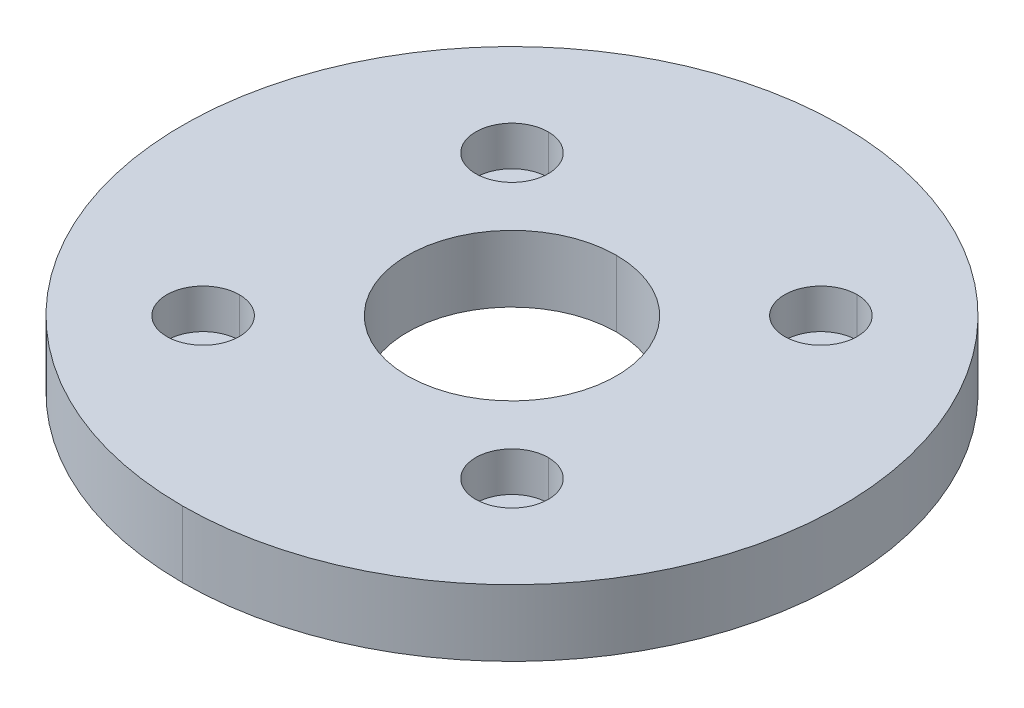
ISO-10303-21;
HEADER;
FILE_DESCRIPTION(('STEP AP214'),'2;1');
FILE_NAME('part.step','',(''),(''),'','','');
FILE_SCHEMA(('AUTOMOTIVE_DESIGN { 1 0 10303 214 1 1 1 1 }'));
ENDSEC;
DATA;
#1=APPLICATION_CONTEXT('core data for automotive mechanical design processes');
#2=APPLICATION_PROTOCOL_DEFINITION('international standard','automotive_design',2000,#1);
#3=PRODUCT_CONTEXT('',#1,'mechanical');
#4=PRODUCT('Part','Part','',(#3));
#5=PRODUCT_RELATED_PRODUCT_CATEGORY('part','',(#4));
#6=PRODUCT_DEFINITION_FORMATION('','',#4);
#7=PRODUCT_DEFINITION_CONTEXT('part definition',#1,'design');
#8=PRODUCT_DEFINITION('design','',#6,#7);
#9=PRODUCT_DEFINITION_SHAPE('','',#8);
#10=(LENGTH_UNIT() NAMED_UNIT(*) SI_UNIT(.MILLI.,.METRE.));
#11=(NAMED_UNIT(*) PLANE_ANGLE_UNIT() SI_UNIT($,.RADIAN.));
#12=(NAMED_UNIT(*) SI_UNIT($,.STERADIAN.) SOLID_ANGLE_UNIT());
#13=UNCERTAINTY_MEASURE_WITH_UNIT(LENGTH_MEASURE(1.E-05),#10,'distance_accuracy_value','');
#14=(GEOMETRIC_REPRESENTATION_CONTEXT(3) GLOBAL_UNCERTAINTY_ASSIGNED_CONTEXT((#13)) GLOBAL_UNIT_ASSIGNED_CONTEXT((#10,
#11,#12)) REPRESENTATION_CONTEXT('',''));
#15=CARTESIAN_POINT('',(0.,0.,0.));
#16=DIRECTION('',(0.,0.,1.));
#17=DIRECTION('',(1.,0.,0.));
#18=AXIS2_PLACEMENT_3D('',#15,#16,#17);
#19=CARTESIAN_POINT('',(8.1317279836453,1.42,-8.1317279836453));
#20=DIRECTION('',(0.,1.,0.));
#21=DIRECTION('',(0.,0.,1.));
#22=AXIS2_PLACEMENT_3D('',#19,#20,#21);
#23=CYLINDRICAL_SURFACE('',#22,1.91);
#24=DIRECTION('',(0.,1.,0.));
#25=VECTOR('',#24,1.);
#26=CARTESIAN_POINT('',(8.1317279836453,1.42,-10.0417279836453));
#27=LINE('',#26,#25);
#28=CARTESIAN_POINT('',(8.1317279836453,1.42,-10.0417279836453));
#29=VERTEX_POINT('',#28);
#30=CARTESIAN_POINT('',(8.1317279836453,3.5,-10.0417279836453));
#31=VERTEX_POINT('',#30);
#32=EDGE_CURVE('E332',#29,#31,#27,.T.);
#33=ORIENTED_EDGE('',*,*,#32,.F.);
#34=CARTESIAN_POINT('',(8.1317279836453,1.42,-8.1317279836453));
#35=DIRECTION('',(0.,1.,0.));
#36=DIRECTION('',(0.,0.,1.));
#37=AXIS2_PLACEMENT_3D('',#34,#35,#36);
#38=CIRCLE('',#37,1.91);
#39=CARTESIAN_POINT('',(8.1317279836453,1.42,-6.2217279836453));
#40=VERTEX_POINT('',#39);
#41=EDGE_CURVE('E10',#40,#29,#38,.T.);
#42=ORIENTED_EDGE('',*,*,#41,.F.);
#43=DIRECTION('',(0.,1.,0.));
#44=VECTOR('',#43,1.);
#45=CARTESIAN_POINT('',(8.1317279836453,1.42,-6.2217279836453));
#46=LINE('',#45,#44);
#47=CARTESIAN_POINT('',(8.1317279836453,3.5,-6.2217279836453));
#48=VERTEX_POINT('',#47);
#49=EDGE_CURVE('E312',#40,#48,#46,.T.);
#50=ORIENTED_EDGE('',*,*,#49,.T.);
#51=CARTESIAN_POINT('',(8.1317279836453,3.5,-8.1317279836453));
#52=DIRECTION('',(0.,1.,0.));
#53=DIRECTION('',(0.,0.,1.));
#54=AXIS2_PLACEMENT_3D('',#51,#52,#53);
#55=CIRCLE('',#54,1.91);
#56=EDGE_CURVE('E356',#48,#31,#55,.T.);
#57=ORIENTED_EDGE('',*,*,#56,.T.);
#58=EDGE_LOOP('',(#33,#42,#50,#57));
#59=FACE_BOUND('',#58,.T.);
#60=ADVANCED_FACE('F16',(#59),#23,.F.);
#61=CARTESIAN_POINT('',(8.1317279836453,1.42,-8.1317279836453));
#62=DIRECTION('',(0.,1.,0.));
#63=DIRECTION('',(1.,0.,0.));
#64=AXIS2_PLACEMENT_3D('',#61,#62,#63);
#65=PLANE('',#64);
#66=CARTESIAN_POINT('',(8.1317279836453,1.42,-8.1317279836453));
#67=DIRECTION('',(0.,-1.,0.));
#68=DIRECTION('',(0.,0.,1.));
#69=AXIS2_PLACEMENT_3D('',#66,#67,#68);
#70=CIRCLE('',#69,1.);
#71=CARTESIAN_POINT('',(8.1317279836453,1.42,-7.13172798364529));
#72=VERTEX_POINT('',#71);
#73=CARTESIAN_POINT('',(8.1317279836453,1.42,-9.1317279836453));
#74=VERTEX_POINT('',#73);
#75=EDGE_CURVE('E249',#72,#74,#70,.T.);
#76=ORIENTED_EDGE('',*,*,#75,.T.);
#77=CARTESIAN_POINT('',(8.1317279836453,1.42,-8.1317279836453));
#78=DIRECTION('',(0.,-1.,0.));
#79=DIRECTION('',(0.,0.,1.));
#80=AXIS2_PLACEMENT_3D('',#77,#78,#79);
#81=CIRCLE('',#80,1.);
#82=EDGE_CURVE('E41',#74,#72,#81,.T.);
#83=ORIENTED_EDGE('',*,*,#82,.T.);
#84=EDGE_LOOP('',(#76,#83));
#85=FACE_BOUND('',#84,.T.);
#86=ORIENTED_EDGE('',*,*,#41,.T.);
#87=CARTESIAN_POINT('',(8.1317279836453,1.42,-8.1317279836453));
#88=DIRECTION('',(0.,1.,0.));
#89=DIRECTION('',(0.,0.,1.));
#90=AXIS2_PLACEMENT_3D('',#87,#88,#89);
#91=CIRCLE('',#90,1.91);
#92=EDGE_CURVE('E328',#29,#40,#91,.T.);
#93=ORIENTED_EDGE('',*,*,#92,.T.);
#94=EDGE_LOOP('',(#86,#93));
#95=FACE_BOUND('',#94,.T.);
#96=ADVANCED_FACE('F817',(#85,#95),#65,.T.);
#97=CARTESIAN_POINT('',(7.42462120245875,1.42,7.42462120245875));
#98=DIRECTION('',(0.,1.,0.));
#99=DIRECTION('',(0.,0.,1.));
#100=AXIS2_PLACEMENT_3D('',#97,#98,#99);
#101=CYLINDRICAL_SURFACE('',#100,1.91);
#102=DIRECTION('',(0.,1.,0.));
#103=VECTOR('',#102,1.);
#104=CARTESIAN_POINT('',(7.42462120245875,1.42,5.51462120245875));
#105=LINE('',#104,#103);
#106=CARTESIAN_POINT('',(7.42462120245875,1.42,5.51462120245875));
#107=VERTEX_POINT('',#106);
#108=CARTESIAN_POINT('',(7.42462120245875,3.5,5.51462120245875));
#109=VERTEX_POINT('',#108);
#110=EDGE_CURVE('E311',#107,#109,#105,.T.);
#111=ORIENTED_EDGE('',*,*,#110,.F.);
#112=CARTESIAN_POINT('',(7.42462120245875,1.42,7.42462120245875));
#113=DIRECTION('',(0.,1.,0.));
#114=DIRECTION('',(0.,0.,1.));
#115=AXIS2_PLACEMENT_3D('',#112,#113,#114);
#116=CIRCLE('',#115,1.91);
#117=CARTESIAN_POINT('',(7.42462120245875,1.42,9.33462120245875));
#118=VERTEX_POINT('',#117);
#119=EDGE_CURVE('E27',#118,#107,#116,.T.);
#120=ORIENTED_EDGE('',*,*,#119,.F.);
#121=DIRECTION('',(0.,1.,0.));
#122=VECTOR('',#121,1.);
#123=CARTESIAN_POINT('',(7.42462120245875,1.42,9.33462120245875));
#124=LINE('',#123,#122);
#125=CARTESIAN_POINT('',(7.42462120245875,3.5,9.33462120245875));
#126=VERTEX_POINT('',#125);
#127=EDGE_CURVE('E322',#118,#126,#124,.T.);
#128=ORIENTED_EDGE('',*,*,#127,.T.);
#129=CARTESIAN_POINT('',(7.42462120245875,3.5,7.42462120245875));
#130=DIRECTION('',(0.,1.,0.));
#131=DIRECTION('',(0.,0.,1.));
#132=AXIS2_PLACEMENT_3D('',#129,#130,#131);
#133=CIRCLE('',#132,1.91);
#134=EDGE_CURVE('E172',#126,#109,#133,.T.);
#135=ORIENTED_EDGE('',*,*,#134,.T.);
#136=EDGE_LOOP('',(#111,#120,#128,#135));
#137=FACE_BOUND('',#136,.T.);
#138=ADVANCED_FACE('F821',(#137),#101,.F.);
#139=CARTESIAN_POINT('',(7.42462120245875,1.42,7.42462120245875));
#140=DIRECTION('',(0.,1.,0.));
#141=DIRECTION('',(1.,0.,0.));
#142=AXIS2_PLACEMENT_3D('',#139,#140,#141);
#143=PLANE('',#142);
#144=CARTESIAN_POINT('',(7.42462120245875,1.42,7.42462120245875));
#145=DIRECTION('',(0.,-1.,0.));
#146=DIRECTION('',(0.,0.,1.));
#147=AXIS2_PLACEMENT_3D('',#144,#145,#146);
#148=CIRCLE('',#147,0.999999999982255);
#149=CARTESIAN_POINT('',(7.42462120245875,1.42,8.424621202441));
#150=VERTEX_POINT('',#149);
#151=CARTESIAN_POINT('',(7.42462120245875,1.42,6.4246212024765));
#152=VERTEX_POINT('',#151);
#153=EDGE_CURVE('E342',#150,#152,#148,.T.);
#154=ORIENTED_EDGE('',*,*,#153,.T.);
#155=CARTESIAN_POINT('',(7.42462120245875,1.42,7.42462120245875));
#156=DIRECTION('',(0.,-1.,0.));
#157=DIRECTION('',(0.,0.,1.));
#158=AXIS2_PLACEMENT_3D('',#155,#156,#157);
#159=CIRCLE('',#158,0.999999999982255);
#160=EDGE_CURVE('E301',#152,#150,#159,.T.);
#161=ORIENTED_EDGE('',*,*,#160,.T.);
#162=EDGE_LOOP('',(#154,#161));
#163=FACE_BOUND('',#162,.T.);
#164=ORIENTED_EDGE('',*,*,#119,.T.);
#165=CARTESIAN_POINT('',(7.42462120245875,1.42,7.42462120245875));
#166=DIRECTION('',(0.,1.,0.));
#167=DIRECTION('',(0.,0.,1.));
#168=AXIS2_PLACEMENT_3D('',#165,#166,#167);
#169=CIRCLE('',#168,1.91);
#170=EDGE_CURVE('E307',#107,#118,#169,.T.);
#171=ORIENTED_EDGE('',*,*,#170,.T.);
#172=EDGE_LOOP('',(#164,#171));
#173=FACE_BOUND('',#172,.T.);
#174=ADVANCED_FACE('F841',(#163,#173),#143,.T.);
#175=CARTESIAN_POINT('',(-8.1317279836453,1.42,8.1317279836453));
#176=DIRECTION('',(0.,1.,0.));
#177=DIRECTION('',(0.,0.,1.));
#178=AXIS2_PLACEMENT_3D('',#175,#176,#177);
#179=CYLINDRICAL_SURFACE('',#178,1.91);
#180=DIRECTION('',(0.,1.,0.));
#181=VECTOR('',#180,1.);
#182=CARTESIAN_POINT('',(-8.1317279836453,1.42,6.2217279836453));
#183=LINE('',#182,#181);
#184=CARTESIAN_POINT('',(-8.1317279836453,1.42,6.2217279836453));
#185=VERTEX_POINT('',#184);
#186=CARTESIAN_POINT('',(-8.1317279836453,3.5,6.2217279836453));
#187=VERTEX_POINT('',#186);
#188=EDGE_CURVE('E235',#185,#187,#183,.T.);
#189=ORIENTED_EDGE('',*,*,#188,.F.);
#190=CARTESIAN_POINT('',(-8.1317279836453,1.42,8.1317279836453));
#191=DIRECTION('',(0.,1.,0.));
#192=DIRECTION('',(0.,0.,1.));
#193=AXIS2_PLACEMENT_3D('',#190,#191,#192);
#194=CIRCLE('',#193,1.91);
#195=CARTESIAN_POINT('',(-8.1317279836453,1.42,10.0417279836453));
#196=VERTEX_POINT('',#195);
#197=EDGE_CURVE('E251',#196,#185,#194,.T.);
#198=ORIENTED_EDGE('',*,*,#197,.F.);
#199=DIRECTION('',(0.,1.,0.));
#200=VECTOR('',#199,1.);
#201=CARTESIAN_POINT('',(-8.1317279836453,1.42,10.0417279836453));
#202=LINE('',#201,#200);
#203=CARTESIAN_POINT('',(-8.1317279836453,3.5,10.0417279836453));
#204=VERTEX_POINT('',#203);
#205=EDGE_CURVE('E364',#196,#204,#202,.T.);
#206=ORIENTED_EDGE('',*,*,#205,.T.);
#207=CARTESIAN_POINT('',(-8.1317279836453,3.5,8.1317279836453));
#208=DIRECTION('',(0.,1.,0.));
#209=DIRECTION('',(0.,0.,1.));
#210=AXIS2_PLACEMENT_3D('',#207,#208,#209);
#211=CIRCLE('',#210,1.91);
#212=EDGE_CURVE('E387',#204,#187,#211,.T.);
#213=ORIENTED_EDGE('',*,*,#212,.T.);
#214=EDGE_LOOP('',(#189,#198,#206,#213));
#215=FACE_BOUND('',#214,.T.);
#216=ADVANCED_FACE('F764',(#215),#179,.F.);
#217=CARTESIAN_POINT('',(-8.1317279836453,1.42,8.1317279836453));
#218=DIRECTION('',(0.,1.,0.));
#219=DIRECTION('',(1.,0.,0.));
#220=AXIS2_PLACEMENT_3D('',#217,#218,#219);
#221=PLANE('',#220);
#222=CARTESIAN_POINT('',(-8.1317279836453,1.42,8.1317279836453));
#223=DIRECTION('',(0.,-1.,0.));
#224=DIRECTION('',(0.,0.,1.));
#225=AXIS2_PLACEMENT_3D('',#222,#223,#224);
#226=CIRCLE('',#225,1.);
#227=CARTESIAN_POINT('',(-8.1317279836453,1.42,9.1317279836453));
#228=VERTEX_POINT('',#227);
#229=CARTESIAN_POINT('',(-8.1317279836453,1.42,7.1317279836453));
#230=VERTEX_POINT('',#229);
#231=EDGE_CURVE('E350',#228,#230,#226,.T.);
#232=ORIENTED_EDGE('',*,*,#231,.T.);
#233=CARTESIAN_POINT('',(-8.1317279836453,1.42,8.1317279836453));
#234=DIRECTION('',(0.,-1.,0.));
#235=DIRECTION('',(0.,0.,1.));
#236=AXIS2_PLACEMENT_3D('',#233,#234,#235);
#237=CIRCLE('',#236,1.);
#238=EDGE_CURVE('E291',#230,#228,#237,.T.);
#239=ORIENTED_EDGE('',*,*,#238,.T.);
#240=EDGE_LOOP('',(#232,#239));
#241=FACE_BOUND('',#240,.T.);
#242=ORIENTED_EDGE('',*,*,#197,.T.);
#243=CARTESIAN_POINT('',(-8.1317279836453,1.42,8.1317279836453));
#244=DIRECTION('',(0.,1.,0.));
#245=DIRECTION('',(0.,0.,1.));
#246=AXIS2_PLACEMENT_3D('',#243,#244,#245);
#247=CIRCLE('',#246,1.91);
#248=EDGE_CURVE('E239',#185,#196,#247,.T.);
#249=ORIENTED_EDGE('',*,*,#248,.T.);
#250=EDGE_LOOP('',(#242,#249));
#251=FACE_BOUND('',#250,.T.);
#252=ADVANCED_FACE('F425',(#241,#251),#221,.T.);
#253=CARTESIAN_POINT('',(-7.42462120245874,1.42,-7.42462120245876));
#254=DIRECTION('',(0.,1.,0.));
#255=DIRECTION('',(0.,0.,1.));
#256=AXIS2_PLACEMENT_3D('',#253,#254,#255);
#257=CYLINDRICAL_SURFACE('',#256,1.91);
#258=DIRECTION('',(0.,1.,0.));
#259=VECTOR('',#258,1.);
#260=CARTESIAN_POINT('',(-7.42462120245874,1.42,-9.33462120245876));
#261=LINE('',#260,#259);
#262=CARTESIAN_POINT('',(-7.42462120245874,1.42,-9.33462120245876));
#263=VERTEX_POINT('',#262);
#264=CARTESIAN_POINT('',(-7.42462120245874,3.5,-9.33462120245876));
#265=VERTEX_POINT('',#264);
#266=EDGE_CURVE('E284',#263,#265,#261,.T.);
#267=ORIENTED_EDGE('',*,*,#266,.F.);
#268=CARTESIAN_POINT('',(-7.42462120245874,1.42,-7.42462120245876));
#269=DIRECTION('',(0.,1.,0.));
#270=DIRECTION('',(0.,0.,1.));
#271=AXIS2_PLACEMENT_3D('',#268,#269,#270);
#272=CIRCLE('',#271,1.91);
#273=CARTESIAN_POINT('',(-7.42462120245874,1.42,-5.51462120245876));
#274=VERTEX_POINT('',#273);
#275=EDGE_CURVE('E254',#274,#263,#272,.T.);
#276=ORIENTED_EDGE('',*,*,#275,.F.);
#277=DIRECTION('',(0.,1.,0.));
#278=VECTOR('',#277,1.);
#279=CARTESIAN_POINT('',(-7.42462120245874,1.42,-5.51462120245876));
#280=LINE('',#279,#278);
#281=CARTESIAN_POINT('',(-7.42462120245874,3.5,-5.51462120245876));
#282=VERTEX_POINT('',#281);
#283=EDGE_CURVE('E297',#274,#282,#280,.T.);
#284=ORIENTED_EDGE('',*,*,#283,.T.);
#285=CARTESIAN_POINT('',(-7.42462120245874,3.5,-7.42462120245876));
#286=DIRECTION('',(0.,1.,0.));
#287=DIRECTION('',(0.,0.,1.));
#288=AXIS2_PLACEMENT_3D('',#285,#286,#287);
#289=CIRCLE('',#288,1.91);
#290=EDGE_CURVE('E317',#282,#265,#289,.T.);
#291=ORIENTED_EDGE('',*,*,#290,.T.);
#292=EDGE_LOOP('',(#267,#276,#284,#291));
#293=FACE_BOUND('',#292,.T.);
#294=ADVANCED_FACE('F763',(#293),#257,.F.);
#295=CARTESIAN_POINT('',(-7.42462120245874,1.42,-7.42462120245876));
#296=DIRECTION('',(0.,1.,0.));
#297=DIRECTION('',(1.,0.,0.));
#298=AXIS2_PLACEMENT_3D('',#295,#296,#297);
#299=PLANE('',#298);
#300=CARTESIAN_POINT('',(-7.42462120245874,1.42,-7.42462120245876));
#301=DIRECTION('',(0.,-1.,0.));
#302=DIRECTION('',(0.,0.,1.));
#303=AXIS2_PLACEMENT_3D('',#300,#301,#302);
#304=CIRCLE('',#303,1.);
#305=CARTESIAN_POINT('',(-7.42462120245874,1.42,-6.42462120245876));
#306=VERTEX_POINT('',#305);
#307=CARTESIAN_POINT('',(-7.42462120245874,1.42,-8.42462120245876));
#308=VERTEX_POINT('',#307);
#309=EDGE_CURVE('E205',#306,#308,#304,.T.);
#310=ORIENTED_EDGE('',*,*,#309,.T.);
#311=CARTESIAN_POINT('',(-7.42462120245874,1.42,-7.42462120245876));
#312=DIRECTION('',(0.,-1.,0.));
#313=DIRECTION('',(0.,0.,1.));
#314=AXIS2_PLACEMENT_3D('',#311,#312,#313);
#315=CIRCLE('',#314,1.);
#316=EDGE_CURVE('E200',#308,#306,#315,.T.);
#317=ORIENTED_EDGE('',*,*,#316,.T.);
#318=EDGE_LOOP('',(#310,#317));
#319=FACE_BOUND('',#318,.T.);
#320=ORIENTED_EDGE('',*,*,#275,.T.);
#321=CARTESIAN_POINT('',(-7.42462120245874,1.42,-7.42462120245876));
#322=DIRECTION('',(0.,1.,0.));
#323=DIRECTION('',(0.,0.,1.));
#324=AXIS2_PLACEMENT_3D('',#321,#322,#323);
#325=CIRCLE('',#324,1.91);
#326=EDGE_CURVE('E288',#263,#274,#325,.T.);
#327=ORIENTED_EDGE('',*,*,#326,.T.);
#328=EDGE_LOOP('',(#320,#327));
#329=FACE_BOUND('',#328,.T.);
#330=ADVANCED_FACE('F202',(#319,#329),#299,.T.);
#331=CARTESIAN_POINT('',(0.,3.5,0.));
#332=DIRECTION('',(0.,-1.,0.));
#333=DIRECTION('',(0.,0.,-1.));
#334=AXIS2_PLACEMENT_3D('',#331,#332,#333);
#335=CYLINDRICAL_SURFACE('',#334,5.5);
#336=DIRECTION('',(0.,-1.,0.));
#337=VECTOR('',#336,1.);
#338=CARTESIAN_POINT('',(0.,3.5,5.5));
#339=LINE('',#338,#337);
#340=CARTESIAN_POINT('',(0.,3.5,5.5));
#341=VERTEX_POINT('',#340);
#342=CARTESIAN_POINT('',(0.,0.,5.5));
#343=VERTEX_POINT('',#342);
#344=EDGE_CURVE('E273',#341,#343,#339,.T.);
#345=ORIENTED_EDGE('',*,*,#344,.F.);
#346=CARTESIAN_POINT('',(0.,3.5,0.));
#347=DIRECTION('',(0.,1.,0.));
#348=DIRECTION('',(0.,0.,1.));
#349=AXIS2_PLACEMENT_3D('',#346,#347,#348);
#350=CIRCLE('',#349,5.5);
#351=CARTESIAN_POINT('',(0.,3.5,-5.5));
#352=VERTEX_POINT('',#351);
#353=EDGE_CURVE('E313',#341,#352,#350,.T.);
#354=ORIENTED_EDGE('',*,*,#353,.T.);
#355=DIRECTION('',(0.,-1.,0.));
#356=VECTOR('',#355,1.);
#357=CARTESIAN_POINT('',(0.,3.5,-5.5));
#358=LINE('',#357,#356);
#359=CARTESIAN_POINT('',(0.,0.,-5.5));
#360=VERTEX_POINT('',#359);
#361=EDGE_CURVE('E258',#352,#360,#358,.T.);
#362=ORIENTED_EDGE('',*,*,#361,.T.);
#363=CARTESIAN_POINT('',(0.,0.,0.));
#364=DIRECTION('',(0.,1.,0.));
#365=DIRECTION('',(0.,0.,1.));
#366=AXIS2_PLACEMENT_3D('',#363,#364,#365);
#367=CIRCLE('',#366,5.5);
#368=EDGE_CURVE('E327',#343,#360,#367,.T.);
#369=ORIENTED_EDGE('',*,*,#368,.F.);
#370=EDGE_LOOP('',(#345,#354,#362,#369));
#371=FACE_BOUND('',#370,.T.);
#372=ADVANCED_FACE('F890',(#371),#335,.F.);
#373=CARTESIAN_POINT('',(0.,3.5,0.));
#374=DIRECTION('',(0.,-1.,0.));
#375=DIRECTION('',(0.,0.,-1.));
#376=AXIS2_PLACEMENT_3D('',#373,#374,#375);
#377=CYLINDRICAL_SURFACE('',#376,17.35);
#378=DIRECTION('',(0.,-1.,0.));
#379=VECTOR('',#378,1.);
#380=CARTESIAN_POINT('',(0.,3.5,17.35));
#381=LINE('',#380,#379);
#382=CARTESIAN_POINT('',(0.,3.5,17.35));
#383=VERTEX_POINT('',#382);
#384=CARTESIAN_POINT('',(0.,0.,17.35));
#385=VERTEX_POINT('',#384);
#386=EDGE_CURVE('E20',#383,#385,#381,.T.);
#387=ORIENTED_EDGE('',*,*,#386,.F.);
#388=CARTESIAN_POINT('',(0.,3.5,0.));
#389=DIRECTION('',(0.,1.,0.));
#390=DIRECTION('',(0.,0.,1.));
#391=AXIS2_PLACEMENT_3D('',#388,#389,#390);
#392=CIRCLE('',#391,17.35);
#393=CARTESIAN_POINT('',(0.,3.5,-17.35));
#394=VERTEX_POINT('',#393);
#395=EDGE_CURVE('E210',#394,#383,#392,.T.);
#396=ORIENTED_EDGE('',*,*,#395,.F.);
#397=DIRECTION('',(0.,-1.,0.));
#398=VECTOR('',#397,1.);
#399=CARTESIAN_POINT('',(0.,3.5,-17.35));
#400=LINE('',#399,#398);
#401=CARTESIAN_POINT('',(0.,0.,-17.35));
#402=VERTEX_POINT('',#401);
#403=EDGE_CURVE('E296',#394,#402,#400,.T.);
#404=ORIENTED_EDGE('',*,*,#403,.T.);
#405=CARTESIAN_POINT('',(0.,0.,0.));
#406=DIRECTION('',(0.,1.,0.));
#407=DIRECTION('',(0.,0.,1.));
#408=AXIS2_PLACEMENT_3D('',#405,#406,#407);
#409=CIRCLE('',#408,17.35);
#410=EDGE_CURVE('E316',#402,#385,#409,.T.);
#411=ORIENTED_EDGE('',*,*,#410,.T.);
#412=EDGE_LOOP('',(#387,#396,#404,#411));
#413=FACE_BOUND('',#412,.T.);
#414=ADVANCED_FACE('F440',(#413),#377,.T.);
#415=CARTESIAN_POINT('',(0.,0.,0.));
#416=DIRECTION('',(0.,1.,0.));
#417=DIRECTION('',(1.,0.,0.));
#418=AXIS2_PLACEMENT_3D('',#415,#416,#417);
#419=PLANE('',#418);
#420=CARTESIAN_POINT('',(0.,0.,0.));
#421=DIRECTION('',(0.,1.,0.));
#422=DIRECTION('',(0.,0.,1.));
#423=AXIS2_PLACEMENT_3D('',#420,#421,#422);
#424=CIRCLE('',#423,5.5);
#425=EDGE_CURVE('E262',#360,#343,#424,.T.);
#426=ORIENTED_EDGE('',*,*,#425,.T.);
#427=ORIENTED_EDGE('',*,*,#368,.T.);
#428=EDGE_LOOP('',(#426,#427));
#429=FACE_BOUND('',#428,.T.);
#430=CARTESIAN_POINT('',(8.1317279836453,0.,-8.1317279836453));
#431=DIRECTION('',(0.,1.,0.));
#432=DIRECTION('',(0.,0.,1.));
#433=AXIS2_PLACEMENT_3D('',#430,#431,#432);
#434=CIRCLE('',#433,1.);
#435=CARTESIAN_POINT('',(8.1317279836453,0.,-7.13172798364529));
#436=VERTEX_POINT('',#435);
#437=CARTESIAN_POINT('',(8.1317279836453,0.,-9.1317279836453));
#438=VERTEX_POINT('',#437);
#439=EDGE_CURVE('E257',#436,#438,#434,.T.);
#440=ORIENTED_EDGE('',*,*,#439,.T.);
#441=CARTESIAN_POINT('',(8.1317279836453,0.,-8.1317279836453));
#442=DIRECTION('',(0.,1.,0.));
#443=DIRECTION('',(0.,0.,1.));
#444=AXIS2_PLACEMENT_3D('',#441,#442,#443);
#445=CIRCLE('',#444,1.);
#446=EDGE_CURVE('E250',#438,#436,#445,.T.);
#447=ORIENTED_EDGE('',*,*,#446,.T.);
#448=EDGE_LOOP('',(#440,#447));
#449=FACE_BOUND('',#448,.T.);
#450=CARTESIAN_POINT('',(7.42462120245875,0.,7.42462120245875));
#451=DIRECTION('',(0.,1.,0.));
#452=DIRECTION('',(0.,0.,1.));
#453=AXIS2_PLACEMENT_3D('',#450,#451,#452);
#454=CIRCLE('',#453,0.999999999982255);
#455=CARTESIAN_POINT('',(7.42462120245875,0.,8.424621202441));
#456=VERTEX_POINT('',#455);
#457=CARTESIAN_POINT('',(7.42462120245875,0.,6.4246212024765));
#458=VERTEX_POINT('',#457);
#459=EDGE_CURVE('E306',#456,#458,#454,.T.);
#460=ORIENTED_EDGE('',*,*,#459,.T.);
#461=CARTESIAN_POINT('',(7.42462120245875,0.,7.42462120245875));
#462=DIRECTION('',(0.,1.,0.));
#463=DIRECTION('',(0.,0.,1.));
#464=AXIS2_PLACEMENT_3D('',#461,#462,#463);
#465=CIRCLE('',#464,0.999999999982255);
#466=EDGE_CURVE('E368',#458,#456,#465,.T.);
#467=ORIENTED_EDGE('',*,*,#466,.T.);
#468=EDGE_LOOP('',(#460,#467));
#469=FACE_BOUND('',#468,.T.);
#470=CARTESIAN_POINT('',(-8.1317279836453,0.,8.1317279836453));
#471=DIRECTION('',(0.,1.,0.));
#472=DIRECTION('',(0.,0.,1.));
#473=AXIS2_PLACEMENT_3D('',#470,#471,#472);
#474=CIRCLE('',#473,1.);
#475=CARTESIAN_POINT('',(-8.1317279836453,0.,9.1317279836453));
#476=VERTEX_POINT('',#475);
#477=CARTESIAN_POINT('',(-8.1317279836453,0.,7.1317279836453));
#478=VERTEX_POINT('',#477);
#479=EDGE_CURVE('E305',#476,#478,#474,.T.);
#480=ORIENTED_EDGE('',*,*,#479,.T.);
#481=CARTESIAN_POINT('',(-8.1317279836453,0.,8.1317279836453));
#482=DIRECTION('',(0.,1.,0.));
#483=DIRECTION('',(0.,0.,1.));
#484=AXIS2_PLACEMENT_3D('',#481,#482,#483);
#485=CIRCLE('',#484,1.);
#486=EDGE_CURVE('E220',#478,#476,#485,.T.);
#487=ORIENTED_EDGE('',*,*,#486,.T.);
#488=EDGE_LOOP('',(#480,#487));
#489=FACE_BOUND('',#488,.T.);
#490=CARTESIAN_POINT('',(-7.42462120245874,0.,-7.42462120245876));
#491=DIRECTION('',(0.,1.,0.));
#492=DIRECTION('',(0.,0.,1.));
#493=AXIS2_PLACEMENT_3D('',#490,#491,#492);
#494=CIRCLE('',#493,1.);
#495=CARTESIAN_POINT('',(-7.42462120245874,0.,-6.42462120245876));
#496=VERTEX_POINT('',#495);
#497=CARTESIAN_POINT('',(-7.42462120245874,0.,-8.42462120245876));
#498=VERTEX_POINT('',#497);
#499=EDGE_CURVE('E211',#496,#498,#494,.T.);
#500=ORIENTED_EDGE('',*,*,#499,.T.);
#501=CARTESIAN_POINT('',(-7.42462120245874,0.,-7.42462120245876));
#502=DIRECTION('',(0.,1.,0.));
#503=DIRECTION('',(0.,0.,1.));
#504=AXIS2_PLACEMENT_3D('',#501,#502,#503);
#505=CIRCLE('',#504,1.);
#506=EDGE_CURVE('E229',#498,#496,#505,.T.);
#507=ORIENTED_EDGE('',*,*,#506,.T.);
#508=EDGE_LOOP('',(#500,#507));
#509=FACE_BOUND('',#508,.T.);
#510=ORIENTED_EDGE('',*,*,#410,.F.);
#511=CARTESIAN_POINT('',(0.,0.,0.));
#512=DIRECTION('',(0.,1.,0.));
#513=DIRECTION('',(0.,0.,1.));
#514=AXIS2_PLACEMENT_3D('',#511,#512,#513);
#515=CIRCLE('',#514,17.35);
#516=EDGE_CURVE('E292',#385,#402,#515,.T.);
#517=ORIENTED_EDGE('',*,*,#516,.F.);
#518=EDGE_LOOP('',(#510,#517));
#519=FACE_BOUND('',#518,.T.);
#520=ADVANCED_FACE('F436',(#429,#449,#469,#489,#509,#519),#419,.F.);
#521=CARTESIAN_POINT('',(0.,3.5,0.));
#522=DIRECTION('',(0.,1.,0.));
#523=DIRECTION('',(1.,0.,0.));
#524=AXIS2_PLACEMENT_3D('',#521,#522,#523);
#525=PLANE('',#524);
#526=CARTESIAN_POINT('',(0.,3.5,0.));
#527=DIRECTION('',(0.,1.,0.));
#528=DIRECTION('',(0.,0.,1.));
#529=AXIS2_PLACEMENT_3D('',#526,#527,#528);
#530=CIRCLE('',#529,5.5);
#531=EDGE_CURVE('E280',#352,#341,#530,.T.);
#532=ORIENTED_EDGE('',*,*,#531,.F.);
#533=ORIENTED_EDGE('',*,*,#353,.F.);
#534=EDGE_LOOP('',(#532,#533));
#535=FACE_BOUND('',#534,.T.);
#536=ORIENTED_EDGE('',*,*,#290,.F.);
#537=CARTESIAN_POINT('',(-7.42462120245874,3.5,-7.42462120245876));
#538=DIRECTION('',(0.,1.,0.));
#539=DIRECTION('',(0.,0.,1.));
#540=AXIS2_PLACEMENT_3D('',#537,#538,#539);
#541=CIRCLE('',#540,1.91);
#542=EDGE_CURVE('E233',#265,#282,#541,.T.);
#543=ORIENTED_EDGE('',*,*,#542,.F.);
#544=EDGE_LOOP('',(#536,#543));
#545=FACE_BOUND('',#544,.T.);
#546=ORIENTED_EDGE('',*,*,#56,.F.);
#547=CARTESIAN_POINT('',(8.1317279836453,3.5,-8.1317279836453));
#548=DIRECTION('',(0.,1.,0.));
#549=DIRECTION('',(0.,0.,1.));
#550=AXIS2_PLACEMENT_3D('',#547,#548,#549);
#551=CIRCLE('',#550,1.91);
#552=EDGE_CURVE('E335',#31,#48,#551,.T.);
#553=ORIENTED_EDGE('',*,*,#552,.F.);
#554=EDGE_LOOP('',(#546,#553));
#555=FACE_BOUND('',#554,.T.);
#556=ORIENTED_EDGE('',*,*,#134,.F.);
#557=CARTESIAN_POINT('',(7.42462120245875,3.5,7.42462120245875));
#558=DIRECTION('',(0.,1.,0.));
#559=DIRECTION('',(0.,0.,1.));
#560=AXIS2_PLACEMENT_3D('',#557,#558,#559);
#561=CIRCLE('',#560,1.91);
#562=EDGE_CURVE('E318',#109,#126,#561,.T.);
#563=ORIENTED_EDGE('',*,*,#562,.F.);
#564=EDGE_LOOP('',(#556,#563));
#565=FACE_BOUND('',#564,.T.);
#566=ORIENTED_EDGE('',*,*,#212,.F.);
#567=CARTESIAN_POINT('',(-8.1317279836453,3.5,8.1317279836453));
#568=DIRECTION('',(0.,1.,0.));
#569=DIRECTION('',(0.,0.,1.));
#570=AXIS2_PLACEMENT_3D('',#567,#568,#569);
#571=CIRCLE('',#570,1.91);
#572=EDGE_CURVE('E238',#187,#204,#571,.T.);
#573=ORIENTED_EDGE('',*,*,#572,.F.);
#574=EDGE_LOOP('',(#566,#573));
#575=FACE_BOUND('',#574,.T.);
#576=ORIENTED_EDGE('',*,*,#395,.T.);
#577=CARTESIAN_POINT('',(0.,3.5,0.));
#578=DIRECTION('',(0.,1.,0.));
#579=DIRECTION('',(0.,0.,1.));
#580=AXIS2_PLACEMENT_3D('',#577,#578,#579);
#581=CIRCLE('',#580,17.35);
#582=EDGE_CURVE('E261',#383,#394,#581,.T.);
#583=ORIENTED_EDGE('',*,*,#582,.T.);
#584=EDGE_LOOP('',(#576,#583));
#585=FACE_BOUND('',#584,.T.);
#586=ADVANCED_FACE('F439',(#535,#545,#555,#565,#575,#585),#525,.T.);
#587=CARTESIAN_POINT('',(-7.42462120245874,-5.,-7.42462120245876));
#588=DIRECTION('',(0.,1.,0.));
#589=DIRECTION('',(0.,0.,1.));
#590=AXIS2_PLACEMENT_3D('',#587,#588,#589);
#591=CYLINDRICAL_SURFACE('',#590,1.);
#592=DIRECTION('',(0.,1.,0.));
#593=VECTOR('',#592,1.);
#594=CARTESIAN_POINT('',(-7.42462120245874,-5.,-8.42462120245876));
#595=LINE('',#594,#593);
#596=EDGE_CURVE('E222',#498,#308,#595,.T.);
#597=ORIENTED_EDGE('',*,*,#596,.F.);
#598=ORIENTED_EDGE('',*,*,#499,.F.);
#599=DIRECTION('',(0.,1.,0.));
#600=VECTOR('',#599,1.);
#601=CARTESIAN_POINT('',(-7.42462120245874,-5.,-6.42462120245876));
#602=LINE('',#601,#600);
#603=EDGE_CURVE('E214',#496,#306,#602,.T.);
#604=ORIENTED_EDGE('',*,*,#603,.T.);
#605=ORIENTED_EDGE('',*,*,#316,.F.);
#606=EDGE_LOOP('',(#597,#598,#604,#605));
#607=FACE_BOUND('',#606,.T.);
#608=ADVANCED_FACE('F215',(#607),#591,.F.);
#609=CARTESIAN_POINT('',(-8.1317279836453,-5.,8.1317279836453));
#610=DIRECTION('',(0.,1.,0.));
#611=DIRECTION('',(0.,0.,1.));
#612=AXIS2_PLACEMENT_3D('',#609,#610,#611);
#613=CYLINDRICAL_SURFACE('',#612,1.);
#614=DIRECTION('',(0.,1.,0.));
#615=VECTOR('',#614,1.);
#616=CARTESIAN_POINT('',(-8.1317279836453,-5.,7.1317279836453));
#617=LINE('',#616,#615);
#618=EDGE_CURVE('E244',#478,#230,#617,.T.);
#619=ORIENTED_EDGE('',*,*,#618,.F.);
#620=ORIENTED_EDGE('',*,*,#479,.F.);
#621=DIRECTION('',(0.,1.,0.));
#622=VECTOR('',#621,1.);
#623=CARTESIAN_POINT('',(-8.1317279836453,-5.,9.1317279836453));
#624=LINE('',#623,#622);
#625=EDGE_CURVE('E354',#476,#228,#624,.T.);
#626=ORIENTED_EDGE('',*,*,#625,.T.);
#627=ORIENTED_EDGE('',*,*,#238,.F.);
#628=EDGE_LOOP('',(#619,#620,#626,#627));
#629=FACE_BOUND('',#628,.T.);
#630=ADVANCED_FACE('F431',(#629),#613,.F.);
#631=CARTESIAN_POINT('',(7.42462120245875,-5.,7.42462120245875));
#632=DIRECTION('',(0.,1.,0.));
#633=DIRECTION('',(0.,0.,1.));
#634=AXIS2_PLACEMENT_3D('',#631,#632,#633);
#635=CYLINDRICAL_SURFACE('',#634,0.999999999982255);
#636=DIRECTION('',(0.,1.,0.));
#637=VECTOR('',#636,1.);
#638=CARTESIAN_POINT('',(7.42462120245875,-5.,6.4246212024765));
#639=LINE('',#638,#637);
#640=EDGE_CURVE('E347',#458,#152,#639,.T.);
#641=ORIENTED_EDGE('',*,*,#640,.F.);
#642=ORIENTED_EDGE('',*,*,#459,.F.);
#643=DIRECTION('',(0.,1.,0.));
#644=VECTOR('',#643,1.);
#645=CARTESIAN_POINT('',(7.42462120245875,-5.,8.424621202441));
#646=LINE('',#645,#644);
#647=EDGE_CURVE('E346',#456,#150,#646,.T.);
#648=ORIENTED_EDGE('',*,*,#647,.T.);
#649=ORIENTED_EDGE('',*,*,#160,.F.);
#650=EDGE_LOOP('',(#641,#642,#648,#649));
#651=FACE_BOUND('',#650,.T.);
#652=ADVANCED_FACE('F771',(#651),#635,.F.);
#653=CARTESIAN_POINT('',(8.1317279836453,-5.,-8.1317279836453));
#654=DIRECTION('',(0.,1.,0.));
#655=DIRECTION('',(0.,0.,1.));
#656=AXIS2_PLACEMENT_3D('',#653,#654,#655);
#657=CYLINDRICAL_SURFACE('',#656,1.);
#658=DIRECTION('',(0.,1.,0.));
#659=VECTOR('',#658,1.);
#660=CARTESIAN_POINT('',(8.1317279836453,-5.,-9.1317279836453));
#661=LINE('',#660,#659);
#662=EDGE_CURVE('E245',#438,#74,#661,.T.);
#663=ORIENTED_EDGE('',*,*,#662,.F.);
#664=ORIENTED_EDGE('',*,*,#439,.F.);
#665=DIRECTION('',(0.,1.,0.));
#666=VECTOR('',#665,1.);
#667=CARTESIAN_POINT('',(8.1317279836453,-5.,-7.13172798364529));
#668=LINE('',#667,#666);
#669=EDGE_CURVE('E255',#436,#72,#668,.T.);
#670=ORIENTED_EDGE('',*,*,#669,.T.);
#671=ORIENTED_EDGE('',*,*,#82,.F.);
#672=EDGE_LOOP('',(#663,#664,#670,#671));
#673=FACE_BOUND('',#672,.T.);
#674=ADVANCED_FACE('F752',(#673),#657,.F.);
#675=CARTESIAN_POINT('',(8.1317279836453,-5.,-8.1317279836453));
#676=DIRECTION('',(0.,1.,0.));
#677=DIRECTION('',(0.,0.,1.));
#678=AXIS2_PLACEMENT_3D('',#675,#676,#677);
#679=CYLINDRICAL_SURFACE('',#678,1.);
#680=ORIENTED_EDGE('',*,*,#446,.F.);
#681=ORIENTED_EDGE('',*,*,#662,.T.);
#682=ORIENTED_EDGE('',*,*,#75,.F.);
#683=ORIENTED_EDGE('',*,*,#669,.F.);
#684=EDGE_LOOP('',(#680,#681,#682,#683));
#685=FACE_BOUND('',#684,.T.);
#686=ADVANCED_FACE('F746',(#685),#679,.F.);
#687=CARTESIAN_POINT('',(7.42462120245875,-5.,7.42462120245875));
#688=DIRECTION('',(0.,1.,0.));
#689=DIRECTION('',(0.,0.,1.));
#690=AXIS2_PLACEMENT_3D('',#687,#688,#689);
#691=CYLINDRICAL_SURFACE('',#690,0.999999999982255);
#692=ORIENTED_EDGE('',*,*,#466,.F.);
#693=ORIENTED_EDGE('',*,*,#640,.T.);
#694=ORIENTED_EDGE('',*,*,#153,.F.);
#695=ORIENTED_EDGE('',*,*,#647,.F.);
#696=EDGE_LOOP('',(#692,#693,#694,#695));
#697=FACE_BOUND('',#696,.T.);
#698=ADVANCED_FACE('F751',(#697),#691,.F.);
#699=CARTESIAN_POINT('',(-8.1317279836453,-5.,8.1317279836453));
#700=DIRECTION('',(0.,1.,0.));
#701=DIRECTION('',(0.,0.,1.));
#702=AXIS2_PLACEMENT_3D('',#699,#700,#701);
#703=CYLINDRICAL_SURFACE('',#702,1.);
#704=ORIENTED_EDGE('',*,*,#486,.F.);
#705=ORIENTED_EDGE('',*,*,#618,.T.);
#706=ORIENTED_EDGE('',*,*,#231,.F.);
#707=ORIENTED_EDGE('',*,*,#625,.F.);
#708=EDGE_LOOP('',(#704,#705,#706,#707));
#709=FACE_BOUND('',#708,.T.);
#710=ADVANCED_FACE('F434',(#709),#703,.F.);
#711=CARTESIAN_POINT('',(-7.42462120245874,-5.,-7.42462120245876));
#712=DIRECTION('',(0.,1.,0.));
#713=DIRECTION('',(0.,0.,1.));
#714=AXIS2_PLACEMENT_3D('',#711,#712,#713);
#715=CYLINDRICAL_SURFACE('',#714,1.);
#716=ORIENTED_EDGE('',*,*,#506,.F.);
#717=ORIENTED_EDGE('',*,*,#596,.T.);
#718=ORIENTED_EDGE('',*,*,#309,.F.);
#719=ORIENTED_EDGE('',*,*,#603,.F.);
#720=EDGE_LOOP('',(#716,#717,#718,#719));
#721=FACE_BOUND('',#720,.T.);
#722=ADVANCED_FACE('F18',(#721),#715,.F.);
#723=CARTESIAN_POINT('',(0.,3.5,0.));
#724=DIRECTION('',(0.,-1.,0.));
#725=DIRECTION('',(0.,0.,-1.));
#726=AXIS2_PLACEMENT_3D('',#723,#724,#725);
#727=CYLINDRICAL_SURFACE('',#726,17.35);
#728=ORIENTED_EDGE('',*,*,#582,.F.);
#729=ORIENTED_EDGE('',*,*,#386,.T.);
#730=ORIENTED_EDGE('',*,*,#516,.T.);
#731=ORIENTED_EDGE('',*,*,#403,.F.);
#732=EDGE_LOOP('',(#728,#729,#730,#731));
#733=FACE_BOUND('',#732,.T.);
#734=ADVANCED_FACE('F451',(#733),#727,.T.);
#735=CARTESIAN_POINT('',(0.,3.5,0.));
#736=DIRECTION('',(0.,-1.,0.));
#737=DIRECTION('',(0.,0.,-1.));
#738=AXIS2_PLACEMENT_3D('',#735,#736,#737);
#739=CYLINDRICAL_SURFACE('',#738,5.5);
#740=ORIENTED_EDGE('',*,*,#531,.T.);
#741=ORIENTED_EDGE('',*,*,#344,.T.);
#742=ORIENTED_EDGE('',*,*,#425,.F.);
#743=ORIENTED_EDGE('',*,*,#361,.F.);
#744=EDGE_LOOP('',(#740,#741,#742,#743));
#745=FACE_BOUND('',#744,.T.);
#746=ADVANCED_FACE('F795',(#745),#739,.F.);
#747=CARTESIAN_POINT('',(-7.42462120245874,1.42,-7.42462120245876));
#748=DIRECTION('',(0.,1.,0.));
#749=DIRECTION('',(0.,0.,1.));
#750=AXIS2_PLACEMENT_3D('',#747,#748,#749);
#751=CYLINDRICAL_SURFACE('',#750,1.91);
#752=ORIENTED_EDGE('',*,*,#326,.F.);
#753=ORIENTED_EDGE('',*,*,#266,.T.);
#754=ORIENTED_EDGE('',*,*,#542,.T.);
#755=ORIENTED_EDGE('',*,*,#283,.F.);
#756=EDGE_LOOP('',(#752,#753,#754,#755));
#757=FACE_BOUND('',#756,.T.);
#758=ADVANCED_FACE('F799',(#757),#751,.F.);
#759=CARTESIAN_POINT('',(-8.1317279836453,1.42,8.1317279836453));
#760=DIRECTION('',(0.,1.,0.));
#761=DIRECTION('',(0.,0.,1.));
#762=AXIS2_PLACEMENT_3D('',#759,#760,#761);
#763=CYLINDRICAL_SURFACE('',#762,1.91);
#764=ORIENTED_EDGE('',*,*,#248,.F.);
#765=ORIENTED_EDGE('',*,*,#188,.T.);
#766=ORIENTED_EDGE('',*,*,#572,.T.);
#767=ORIENTED_EDGE('',*,*,#205,.F.);
#768=EDGE_LOOP('',(#764,#765,#766,#767));
#769=FACE_BOUND('',#768,.T.);
#770=ADVANCED_FACE('F787',(#769),#763,.F.);
#771=CARTESIAN_POINT('',(7.42462120245875,1.42,7.42462120245875));
#772=DIRECTION('',(0.,1.,0.));
#773=DIRECTION('',(0.,0.,1.));
#774=AXIS2_PLACEMENT_3D('',#771,#772,#773);
#775=CYLINDRICAL_SURFACE('',#774,1.91);
#776=ORIENTED_EDGE('',*,*,#170,.F.);
#777=ORIENTED_EDGE('',*,*,#110,.T.);
#778=ORIENTED_EDGE('',*,*,#562,.T.);
#779=ORIENTED_EDGE('',*,*,#127,.F.);
#780=EDGE_LOOP('',(#776,#777,#778,#779));
#781=FACE_BOUND('',#780,.T.);
#782=ADVANCED_FACE('F782',(#781),#775,.F.);
#783=CARTESIAN_POINT('',(8.1317279836453,1.42,-8.1317279836453));
#784=DIRECTION('',(0.,1.,0.));
#785=DIRECTION('',(0.,0.,1.));
#786=AXIS2_PLACEMENT_3D('',#783,#784,#785);
#787=CYLINDRICAL_SURFACE('',#786,1.91);
#788=ORIENTED_EDGE('',*,*,#92,.F.);
#789=ORIENTED_EDGE('',*,*,#32,.T.);
#790=ORIENTED_EDGE('',*,*,#552,.T.);
#791=ORIENTED_EDGE('',*,*,#49,.F.);
#792=EDGE_LOOP('',(#788,#789,#790,#791));
#793=FACE_BOUND('',#792,.T.);
#794=ADVANCED_FACE('F786',(#793),#787,.F.);
#795=CLOSED_SHELL('',(#60,#96,#138,#174,#216,#252,#294,#330,#372,#414,#520,#586,#608,#630,#652,
#674,#686,#698,#710,#722,#734,#746,#758,#770,#782,#794));
#796=MANIFOLD_SOLID_BREP('B1',#795);
#797=ADVANCED_BREP_SHAPE_REPRESENTATION('',(#18,#796),#14);
#798=SHAPE_DEFINITION_REPRESENTATION(#9,#797);
ENDSEC;
END-ISO-10303-21;
